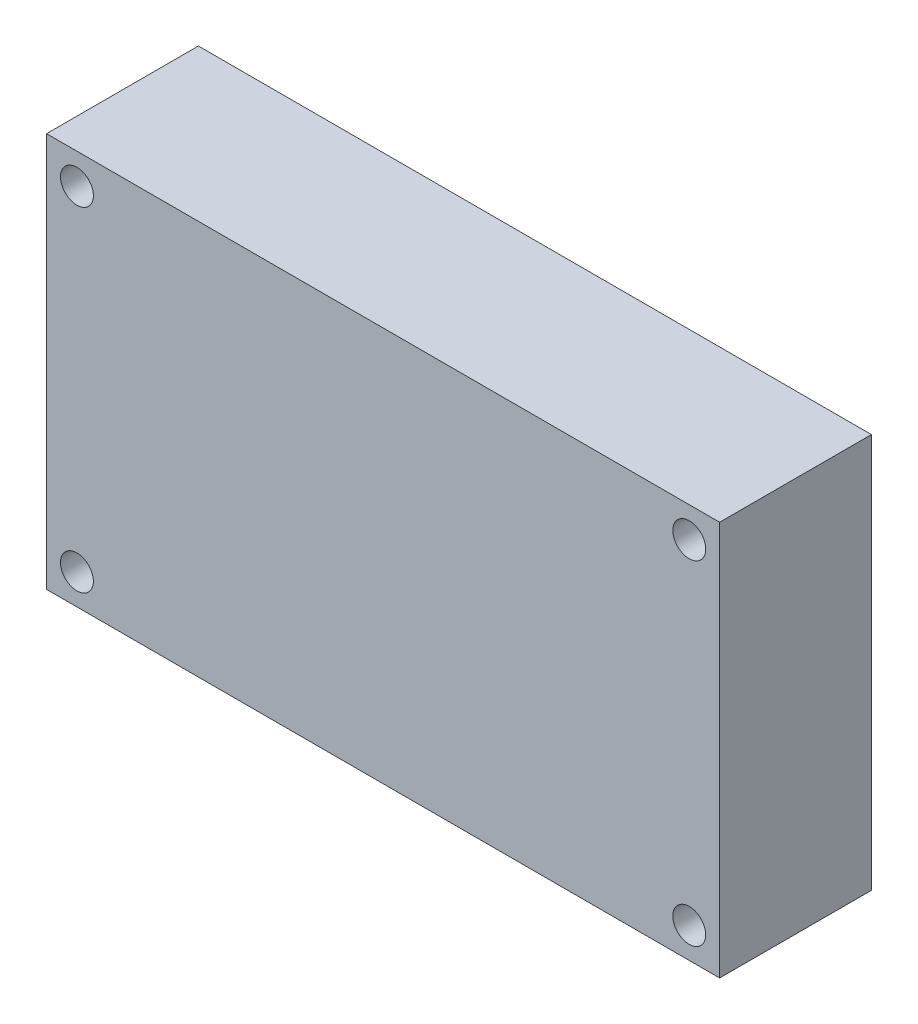
ISO-10303-21;
HEADER;
FILE_DESCRIPTION(('STEP AP214'),'2;1');
FILE_NAME('part.step','',(''),(''),'','','');
FILE_SCHEMA(('AUTOMOTIVE_DESIGN { 1 0 10303 214 1 1 1 1 }'));
ENDSEC;
DATA;
#1=APPLICATION_CONTEXT('core data for automotive mechanical design processes');
#2=APPLICATION_PROTOCOL_DEFINITION('international standard','automotive_design',2000,#1);
#3=PRODUCT_CONTEXT('',#1,'mechanical');
#4=PRODUCT('Part','Part','',(#3));
#5=PRODUCT_RELATED_PRODUCT_CATEGORY('part','',(#4));
#6=PRODUCT_DEFINITION_FORMATION('','',#4);
#7=PRODUCT_DEFINITION_CONTEXT('part definition',#1,'design');
#8=PRODUCT_DEFINITION('design','',#6,#7);
#9=PRODUCT_DEFINITION_SHAPE('','',#8);
#10=(LENGTH_UNIT() NAMED_UNIT(*) SI_UNIT(.MILLI.,.METRE.));
#11=(NAMED_UNIT(*) PLANE_ANGLE_UNIT() SI_UNIT($,.RADIAN.));
#12=(NAMED_UNIT(*) SI_UNIT($,.STERADIAN.) SOLID_ANGLE_UNIT());
#13=UNCERTAINTY_MEASURE_WITH_UNIT(LENGTH_MEASURE(1.E-05),#10,'distance_accuracy_value','');
#14=(GEOMETRIC_REPRESENTATION_CONTEXT(3) GLOBAL_UNCERTAINTY_ASSIGNED_CONTEXT((#13)) GLOBAL_UNIT_ASSIGNED_CONTEXT((#10,
#11,#12)) REPRESENTATION_CONTEXT('',''));
#15=CARTESIAN_POINT('',(0.,0.,0.));
#16=DIRECTION('',(0.,0.,1.));
#17=DIRECTION('',(1.,0.,0.));
#18=AXIS2_PLACEMENT_3D('',#15,#16,#17);
#19=CARTESIAN_POINT('',(0.,0.,15.));
#20=DIRECTION('',(0.,0.,-1.));
#21=DIRECTION('',(-1.,0.,0.));
#22=AXIS2_PLACEMENT_3D('',#19,#20,#21);
#23=PLANE('',#22);
#24=DIRECTION('',(0.,1.,0.));
#25=VECTOR('',#24,1.);
#26=CARTESIAN_POINT('',(33.25,-19.5,15.));
#27=LINE('',#26,#25);
#28=CARTESIAN_POINT('',(33.25,-19.5,15.));
#29=VERTEX_POINT('',#28);
#30=CARTESIAN_POINT('',(33.25,19.5,15.));
#31=VERTEX_POINT('',#30);
#32=EDGE_CURVE('E86',#29,#31,#27,.T.);
#33=ORIENTED_EDGE('',*,*,#32,.T.);
#34=DIRECTION('',(-1.,0.,0.));
#35=VECTOR('',#34,1.);
#36=CARTESIAN_POINT('',(-33.25,19.5,15.));
#37=LINE('',#36,#35);
#38=CARTESIAN_POINT('',(-33.25,19.5,15.));
#39=VERTEX_POINT('',#38);
#40=EDGE_CURVE('E81',#31,#39,#37,.T.);
#41=ORIENTED_EDGE('',*,*,#40,.T.);
#42=DIRECTION('',(0.,-1.,0.));
#43=VECTOR('',#42,1.);
#44=CARTESIAN_POINT('',(-33.25,-19.5,15.));
#45=LINE('',#44,#43);
#46=CARTESIAN_POINT('',(-33.25,-19.5,15.));
#47=VERTEX_POINT('',#46);
#48=EDGE_CURVE('E84',#39,#47,#45,.T.);
#49=ORIENTED_EDGE('',*,*,#48,.T.);
#50=DIRECTION('',(1.,0.,0.));
#51=VECTOR('',#50,1.);
#52=CARTESIAN_POINT('',(-33.25,-19.5,15.));
#53=LINE('',#52,#51);
#54=EDGE_CURVE('E51',#47,#29,#53,.T.);
#55=ORIENTED_EDGE('',*,*,#54,.T.);
#56=EDGE_LOOP('',(#33,#41,#49,#55));
#57=FACE_BOUND('',#56,.T.);
#58=CARTESIAN_POINT('',(-30.25,16.5,15.));
#59=DIRECTION('',(0.,0.,1.));
#60=DIRECTION('',(1.,0.,0.));
#61=AXIS2_PLACEMENT_3D('',#58,#59,#60);
#62=CIRCLE('',#61,1.625);
#63=CARTESIAN_POINT('',(-28.625,16.5,15.));
#64=VERTEX_POINT('',#63);
#65=EDGE_CURVE('E101',#64,#64,#62,.T.);
#66=ORIENTED_EDGE('',*,*,#65,.F.);
#67=EDGE_LOOP('',(#66));
#68=FACE_BOUND('',#67,.T.);
#69=CARTESIAN_POINT('',(30.25,16.5,15.));
#70=DIRECTION('',(0.,0.,1.));
#71=DIRECTION('',(1.,0.,0.));
#72=AXIS2_PLACEMENT_3D('',#69,#70,#71);
#73=CIRCLE('',#72,1.625);
#74=CARTESIAN_POINT('',(31.875,16.5,15.));
#75=VERTEX_POINT('',#74);
#76=EDGE_CURVE('E116',#75,#75,#73,.T.);
#77=ORIENTED_EDGE('',*,*,#76,.F.);
#78=EDGE_LOOP('',(#77));
#79=FACE_BOUND('',#78,.T.);
#80=CARTESIAN_POINT('',(30.25,-16.5,15.));
#81=DIRECTION('',(0.,0.,1.));
#82=DIRECTION('',(1.,0.,0.));
#83=AXIS2_PLACEMENT_3D('',#80,#81,#82);
#84=CIRCLE('',#83,1.625);
#85=CARTESIAN_POINT('',(31.875,-16.5,15.));
#86=VERTEX_POINT('',#85);
#87=EDGE_CURVE('E122',#86,#86,#84,.T.);
#88=ORIENTED_EDGE('',*,*,#87,.F.);
#89=EDGE_LOOP('',(#88));
#90=FACE_BOUND('',#89,.T.);
#91=CARTESIAN_POINT('',(-30.25,-16.5,15.));
#92=DIRECTION('',(0.,0.,1.));
#93=DIRECTION('',(1.,0.,0.));
#94=AXIS2_PLACEMENT_3D('',#91,#92,#93);
#95=CIRCLE('',#94,1.625);
#96=CARTESIAN_POINT('',(-28.625,-16.5,15.));
#97=VERTEX_POINT('',#96);
#98=EDGE_CURVE('E128',#97,#97,#95,.T.);
#99=ORIENTED_EDGE('',*,*,#98,.F.);
#100=EDGE_LOOP('',(#99));
#101=FACE_BOUND('',#100,.T.);
#102=ADVANCED_FACE('F34',(#57,#68,#79,#90,#101),#23,.F.);
#103=CARTESIAN_POINT('',(0.,0.,0.));
#104=DIRECTION('',(0.,0.,-1.));
#105=DIRECTION('',(-1.,0.,0.));
#106=AXIS2_PLACEMENT_3D('',#103,#104,#105);
#107=PLANE('',#106);
#108=CARTESIAN_POINT('',(30.25,-16.5,0.));
#109=DIRECTION('',(0.,0.,1.));
#110=DIRECTION('',(1.,0.,0.));
#111=AXIS2_PLACEMENT_3D('',#108,#109,#110);
#112=CIRCLE('',#111,1.625);
#113=CARTESIAN_POINT('',(31.875,-16.5,0.));
#114=VERTEX_POINT('',#113);
#115=EDGE_CURVE('E125',#114,#114,#112,.T.);
#116=ORIENTED_EDGE('',*,*,#115,.T.);
#117=EDGE_LOOP('',(#116));
#118=FACE_BOUND('',#117,.T.);
#119=CARTESIAN_POINT('',(-30.25,16.5,0.));
#120=DIRECTION('',(0.,0.,1.));
#121=DIRECTION('',(1.,0.,0.));
#122=AXIS2_PLACEMENT_3D('',#119,#120,#121);
#123=CIRCLE('',#122,1.625);
#124=CARTESIAN_POINT('',(-28.625,16.5,0.));
#125=VERTEX_POINT('',#124);
#126=EDGE_CURVE('E113',#125,#125,#123,.T.);
#127=ORIENTED_EDGE('',*,*,#126,.T.);
#128=EDGE_LOOP('',(#127));
#129=FACE_BOUND('',#128,.T.);
#130=DIRECTION('',(0.,1.,0.));
#131=VECTOR('',#130,1.);
#132=CARTESIAN_POINT('',(33.25,-19.5,0.));
#133=LINE('',#132,#131);
#134=CARTESIAN_POINT('',(33.25,-19.5,0.));
#135=VERTEX_POINT('',#134);
#136=CARTESIAN_POINT('',(33.25,19.5,0.));
#137=VERTEX_POINT('',#136);
#138=EDGE_CURVE('E98',#135,#137,#133,.T.);
#139=ORIENTED_EDGE('',*,*,#138,.F.);
#140=DIRECTION('',(1.,0.,0.));
#141=VECTOR('',#140,1.);
#142=CARTESIAN_POINT('',(-33.25,-19.5,0.));
#143=LINE('',#142,#141);
#144=CARTESIAN_POINT('',(-33.25,-19.5,0.));
#145=VERTEX_POINT('',#144);
#146=EDGE_CURVE('E74',#145,#135,#143,.T.);
#147=ORIENTED_EDGE('',*,*,#146,.F.);
#148=DIRECTION('',(0.,-1.,0.));
#149=VECTOR('',#148,1.);
#150=CARTESIAN_POINT('',(-33.25,-19.5,0.));
#151=LINE('',#150,#149);
#152=CARTESIAN_POINT('',(-33.25,19.5,0.));
#153=VERTEX_POINT('',#152);
#154=EDGE_CURVE('E68',#153,#145,#151,.T.);
#155=ORIENTED_EDGE('',*,*,#154,.F.);
#156=DIRECTION('',(-1.,0.,0.));
#157=VECTOR('',#156,1.);
#158=CARTESIAN_POINT('',(-33.25,19.5,0.));
#159=LINE('',#158,#157);
#160=EDGE_CURVE('E90',#137,#153,#159,.T.);
#161=ORIENTED_EDGE('',*,*,#160,.F.);
#162=EDGE_LOOP('',(#139,#147,#155,#161));
#163=FACE_BOUND('',#162,.T.);
#164=CARTESIAN_POINT('',(30.25,16.5,0.));
#165=DIRECTION('',(0.,0.,1.));
#166=DIRECTION('',(1.,0.,0.));
#167=AXIS2_PLACEMENT_3D('',#164,#165,#166);
#168=CIRCLE('',#167,1.625);
#169=CARTESIAN_POINT('',(31.875,16.5,0.));
#170=VERTEX_POINT('',#169);
#171=EDGE_CURVE('E119',#170,#170,#168,.T.);
#172=ORIENTED_EDGE('',*,*,#171,.T.);
#173=EDGE_LOOP('',(#172));
#174=FACE_BOUND('',#173,.T.);
#175=CARTESIAN_POINT('',(-30.25,-16.5,0.));
#176=DIRECTION('',(0.,0.,1.));
#177=DIRECTION('',(1.,0.,0.));
#178=AXIS2_PLACEMENT_3D('',#175,#176,#177);
#179=CIRCLE('',#178,1.625);
#180=CARTESIAN_POINT('',(-28.625,-16.5,0.));
#181=VERTEX_POINT('',#180);
#182=EDGE_CURVE('E131',#181,#181,#179,.T.);
#183=ORIENTED_EDGE('',*,*,#182,.T.);
#184=EDGE_LOOP('',(#183));
#185=FACE_BOUND('',#184,.T.);
#186=ADVANCED_FACE('F109',(#118,#129,#163,#174,#185),#107,.T.);
#187=CARTESIAN_POINT('',(33.25,-19.5,15.));
#188=DIRECTION('',(-1.,0.,0.));
#189=DIRECTION('',(0.,0.,1.));
#190=AXIS2_PLACEMENT_3D('',#187,#188,#189);
#191=PLANE('',#190);
#192=ORIENTED_EDGE('',*,*,#138,.T.);
#193=DIRECTION('',(0.,0.,-1.));
#194=VECTOR('',#193,1.);
#195=CARTESIAN_POINT('',(33.25,19.5,15.));
#196=LINE('',#195,#194);
#197=EDGE_CURVE('E11',#31,#137,#196,.T.);
#198=ORIENTED_EDGE('',*,*,#197,.F.);
#199=ORIENTED_EDGE('',*,*,#32,.F.);
#200=DIRECTION('',(0.,0.,-1.));
#201=VECTOR('',#200,1.);
#202=CARTESIAN_POINT('',(33.25,-19.5,15.));
#203=LINE('',#202,#201);
#204=EDGE_CURVE('E94',#29,#135,#203,.T.);
#205=ORIENTED_EDGE('',*,*,#204,.T.);
#206=EDGE_LOOP('',(#192,#198,#199,#205));
#207=FACE_BOUND('',#206,.T.);
#208=ADVANCED_FACE('F36',(#207),#191,.F.);
#209=CARTESIAN_POINT('',(-33.25,19.5,15.));
#210=DIRECTION('',(0.,-1.,0.));
#211=DIRECTION('',(0.,0.,-1.));
#212=AXIS2_PLACEMENT_3D('',#209,#210,#211);
#213=PLANE('',#212);
#214=ORIENTED_EDGE('',*,*,#160,.T.);
#215=DIRECTION('',(0.,0.,-1.));
#216=VECTOR('',#215,1.);
#217=CARTESIAN_POINT('',(-33.25,19.5,15.));
#218=LINE('',#217,#216);
#219=EDGE_CURVE('E43',#39,#153,#218,.T.);
#220=ORIENTED_EDGE('',*,*,#219,.F.);
#221=ORIENTED_EDGE('',*,*,#40,.F.);
#222=ORIENTED_EDGE('',*,*,#197,.T.);
#223=EDGE_LOOP('',(#214,#220,#221,#222));
#224=FACE_BOUND('',#223,.T.);
#225=ADVANCED_FACE('F89',(#224),#213,.F.);
#226=CARTESIAN_POINT('',(-33.25,-19.5,15.));
#227=DIRECTION('',(1.,0.,0.));
#228=DIRECTION('',(0.,0.,-1.));
#229=AXIS2_PLACEMENT_3D('',#226,#227,#228);
#230=PLANE('',#229);
#231=ORIENTED_EDGE('',*,*,#154,.T.);
#232=DIRECTION('',(0.,0.,-1.));
#233=VECTOR('',#232,1.);
#234=CARTESIAN_POINT('',(-33.25,-19.5,15.));
#235=LINE('',#234,#233);
#236=EDGE_CURVE('E91',#47,#145,#235,.T.);
#237=ORIENTED_EDGE('',*,*,#236,.F.);
#238=ORIENTED_EDGE('',*,*,#48,.F.);
#239=ORIENTED_EDGE('',*,*,#219,.T.);
#240=EDGE_LOOP('',(#231,#237,#238,#239));
#241=FACE_BOUND('',#240,.T.);
#242=ADVANCED_FACE('F92',(#241),#230,.F.);
#243=CARTESIAN_POINT('',(-33.25,-19.5,15.));
#244=DIRECTION('',(0.,1.,0.));
#245=DIRECTION('',(0.,0.,1.));
#246=AXIS2_PLACEMENT_3D('',#243,#244,#245);
#247=PLANE('',#246);
#248=ORIENTED_EDGE('',*,*,#146,.T.);
#249=ORIENTED_EDGE('',*,*,#204,.F.);
#250=ORIENTED_EDGE('',*,*,#54,.F.);
#251=ORIENTED_EDGE('',*,*,#236,.T.);
#252=EDGE_LOOP('',(#248,#249,#250,#251));
#253=FACE_BOUND('',#252,.T.);
#254=ADVANCED_FACE('F106',(#253),#247,.F.);
#255=CARTESIAN_POINT('',(-30.25,16.5,15.));
#256=DIRECTION('',(0.,0.,-1.));
#257=DIRECTION('',(-1.,0.,0.));
#258=AXIS2_PLACEMENT_3D('',#255,#256,#257);
#259=CYLINDRICAL_SURFACE('',#258,1.625);
#260=ORIENTED_EDGE('',*,*,#65,.T.);
#261=EDGE_LOOP('',(#260));
#262=FACE_BOUND('',#261,.T.);
#263=ORIENTED_EDGE('',*,*,#126,.F.);
#264=EDGE_LOOP('',(#263));
#265=FACE_BOUND('',#264,.T.);
#266=ADVANCED_FACE('F148',(#262,#265),#259,.F.);
#267=CARTESIAN_POINT('',(30.25,16.5,15.));
#268=DIRECTION('',(0.,0.,-1.));
#269=DIRECTION('',(-1.,0.,0.));
#270=AXIS2_PLACEMENT_3D('',#267,#268,#269);
#271=CYLINDRICAL_SURFACE('',#270,1.625);
#272=ORIENTED_EDGE('',*,*,#76,.T.);
#273=EDGE_LOOP('',(#272));
#274=FACE_BOUND('',#273,.T.);
#275=ORIENTED_EDGE('',*,*,#171,.F.);
#276=EDGE_LOOP('',(#275));
#277=FACE_BOUND('',#276,.T.);
#278=ADVANCED_FACE('F194',(#274,#277),#271,.F.);
#279=CARTESIAN_POINT('',(30.25,-16.5,15.));
#280=DIRECTION('',(0.,0.,-1.));
#281=DIRECTION('',(-1.,0.,0.));
#282=AXIS2_PLACEMENT_3D('',#279,#280,#281);
#283=CYLINDRICAL_SURFACE('',#282,1.625);
#284=ORIENTED_EDGE('',*,*,#87,.T.);
#285=EDGE_LOOP('',(#284));
#286=FACE_BOUND('',#285,.T.);
#287=ORIENTED_EDGE('',*,*,#115,.F.);
#288=EDGE_LOOP('',(#287));
#289=FACE_BOUND('',#288,.T.);
#290=ADVANCED_FACE('F202',(#286,#289),#283,.F.);
#291=CARTESIAN_POINT('',(-30.25,-16.5,15.));
#292=DIRECTION('',(0.,0.,-1.));
#293=DIRECTION('',(-1.,0.,0.));
#294=AXIS2_PLACEMENT_3D('',#291,#292,#293);
#295=CYLINDRICAL_SURFACE('',#294,1.625);
#296=ORIENTED_EDGE('',*,*,#98,.T.);
#297=EDGE_LOOP('',(#296));
#298=FACE_BOUND('',#297,.T.);
#299=ORIENTED_EDGE('',*,*,#182,.F.);
#300=EDGE_LOOP('',(#299));
#301=FACE_BOUND('',#300,.T.);
#302=ADVANCED_FACE('F137',(#298,#301),#295,.F.);
#303=CLOSED_SHELL('',(#102,#186,#208,#225,#242,#254,#266,#278,#290,#302));
#304=MANIFOLD_SOLID_BREP('B2',#303);
#305=ADVANCED_BREP_SHAPE_REPRESENTATION('',(#18,#304),#14);
#306=SHAPE_DEFINITION_REPRESENTATION(#9,#305);
ENDSEC;
END-ISO-10303-21;
